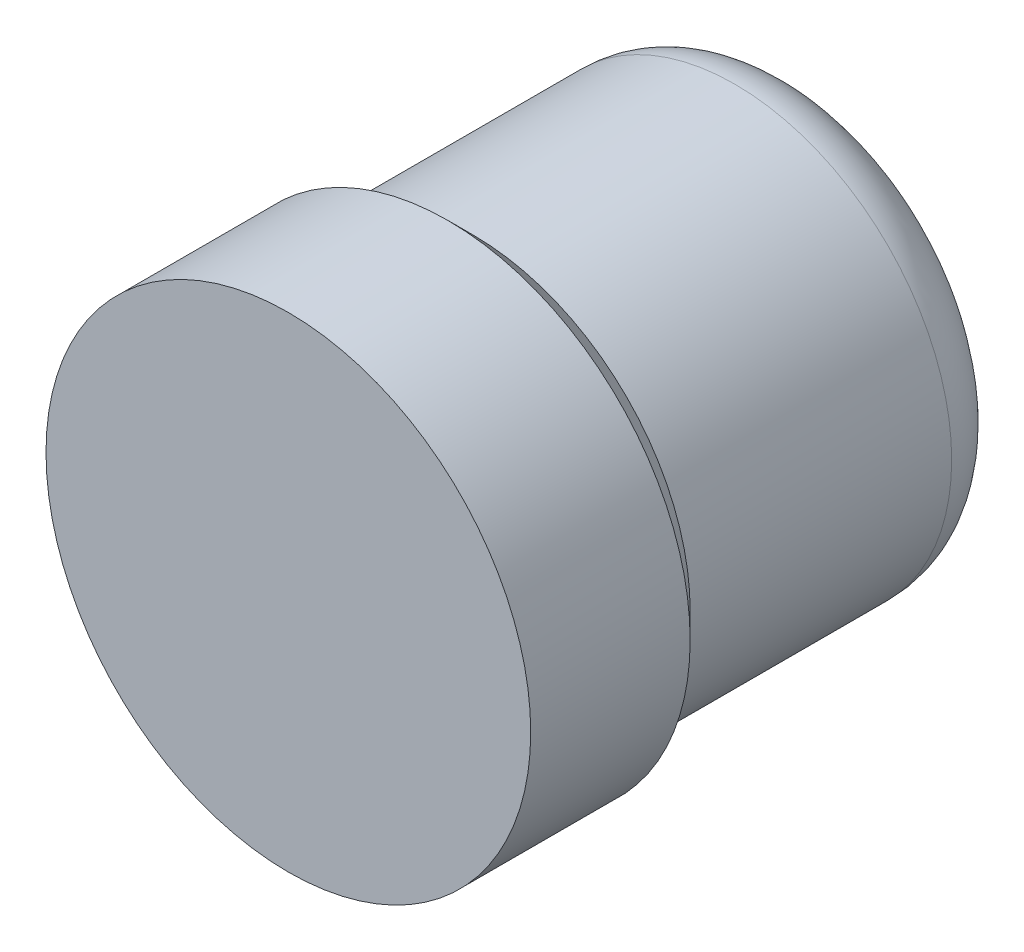
ISO-10303-21;
HEADER;
FILE_DESCRIPTION(('STEP AP214'),'2;1');
FILE_NAME('part.step','',(''),(''),'','','');
FILE_SCHEMA(('AUTOMOTIVE_DESIGN { 1 0 10303 214 1 1 1 1 }'));
ENDSEC;
DATA;
#1=APPLICATION_CONTEXT('core data for automotive mechanical design processes');
#2=APPLICATION_PROTOCOL_DEFINITION('international standard','automotive_design',2000,#1);
#3=PRODUCT_CONTEXT('',#1,'mechanical');
#4=PRODUCT('Part','Part','',(#3));
#5=PRODUCT_RELATED_PRODUCT_CATEGORY('part','',(#4));
#6=PRODUCT_DEFINITION_FORMATION('','',#4);
#7=PRODUCT_DEFINITION_CONTEXT('part definition',#1,'design');
#8=PRODUCT_DEFINITION('design','',#6,#7);
#9=PRODUCT_DEFINITION_SHAPE('','',#8);
#10=(LENGTH_UNIT() NAMED_UNIT(*) SI_UNIT(.MILLI.,.METRE.));
#11=(NAMED_UNIT(*) PLANE_ANGLE_UNIT() SI_UNIT($,.RADIAN.));
#12=(NAMED_UNIT(*) SI_UNIT($,.STERADIAN.) SOLID_ANGLE_UNIT());
#13=UNCERTAINTY_MEASURE_WITH_UNIT(LENGTH_MEASURE(1.E-05),#10,'distance_accuracy_value','');
#14=(GEOMETRIC_REPRESENTATION_CONTEXT(3) GLOBAL_UNCERTAINTY_ASSIGNED_CONTEXT((#13)) GLOBAL_UNIT_ASSIGNED_CONTEXT((#10,
#11,#12)) REPRESENTATION_CONTEXT('',''));
#15=CARTESIAN_POINT('',(0.,0.,0.));
#16=DIRECTION('',(0.,0.,1.));
#17=DIRECTION('',(1.,0.,0.));
#18=AXIS2_PLACEMENT_3D('',#15,#16,#17);
#19=CARTESIAN_POINT('',(4.30211422042248E-13,21.5,-3.));
#20=DIRECTION('',(0.,0.,1.));
#21=DIRECTION('',(1.,0.,0.));
#22=AXIS2_PLACEMENT_3D('',#19,#20,#21);
#23=CYLINDRICAL_SURFACE('',#22,3.8);
#24=CARTESIAN_POINT('',(4.30211422042248E-13,21.5,-2.49999999999999));
#25=DIRECTION('',(0.,0.,1.));
#26=DIRECTION('',(1.,0.,0.));
#27=AXIS2_PLACEMENT_3D('',#24,#25,#26);
#28=CIRCLE('',#27,3.8);
#29=CARTESIAN_POINT('',(3.80000000000043,21.5,-2.49999999999999));
#30=VERTEX_POINT('',#29);
#31=EDGE_CURVE('E38',#30,#30,#28,.T.);
#32=ORIENTED_EDGE('',*,*,#31,.T.);
#33=EDGE_LOOP('',(#32));
#34=FACE_BOUND('',#33,.T.);
#35=CARTESIAN_POINT('',(4.30211422042248E-13,21.5,0.));
#36=DIRECTION('',(0.,0.,1.));
#37=DIRECTION('',(1.,0.,0.));
#38=AXIS2_PLACEMENT_3D('',#35,#36,#37);
#39=CIRCLE('',#38,3.8);
#40=CARTESIAN_POINT('',(3.80000000000043,21.5,0.));
#41=VERTEX_POINT('',#40);
#42=EDGE_CURVE('E51',#41,#41,#39,.T.);
#43=ORIENTED_EDGE('',*,*,#42,.F.);
#44=EDGE_LOOP('',(#43));
#45=FACE_BOUND('',#44,.T.);
#46=ADVANCED_FACE('F31',(#34,#45),#23,.T.);
#47=CARTESIAN_POINT('',(4.30211422042248E-13,21.5,0.));
#48=DIRECTION('',(0.,0.,1.));
#49=DIRECTION('',(1.,0.,0.));
#50=AXIS2_PLACEMENT_3D('',#47,#48,#49);
#51=PLANE('',#50);
#52=ORIENTED_EDGE('',*,*,#42,.T.);
#53=EDGE_LOOP('',(#52));
#54=FACE_BOUND('',#53,.T.);
#55=ADVANCED_FACE('F55',(#54),#51,.T.);
#56=CARTESIAN_POINT('',(4.30211422042248E-13,21.5,-8.));
#57=DIRECTION('',(0.,0.,1.));
#58=DIRECTION('',(1.,0.,0.));
#59=AXIS2_PLACEMENT_3D('',#56,#57,#58);
#60=CYLINDRICAL_SURFACE('',#59,3.4);
#61=CARTESIAN_POINT('',(4.30211422042248E-13,21.5,-2.9));
#62=DIRECTION('',(0.,0.,1.));
#63=DIRECTION('',(1.,0.,0.));
#64=AXIS2_PLACEMENT_3D('',#61,#62,#63);
#65=CIRCLE('',#64,3.4);
#66=CARTESIAN_POINT('',(3.40000000000043,21.5,-2.9));
#67=VERTEX_POINT('',#66);
#68=EDGE_CURVE('E10',#67,#67,#65,.F.);
#69=ORIENTED_EDGE('',*,*,#68,.T.);
#70=EDGE_LOOP('',(#69));
#71=FACE_BOUND('',#70,.T.);
#72=CARTESIAN_POINT('',(4.30211422042248E-13,21.5,-7.));
#73=DIRECTION('',(0.,0.,-1.));
#74=DIRECTION('',(-1.,0.,0.));
#75=AXIS2_PLACEMENT_3D('',#72,#73,#74);
#76=CIRCLE('',#75,3.4);
#77=CARTESIAN_POINT('',(-3.39999999999957,21.5,-7.));
#78=VERTEX_POINT('',#77);
#79=EDGE_CURVE('E42',#78,#78,#76,.F.);
#80=ORIENTED_EDGE('',*,*,#79,.T.);
#81=EDGE_LOOP('',(#80));
#82=FACE_BOUND('',#81,.T.);
#83=ADVANCED_FACE('F62',(#71,#82),#60,.T.);
#84=CARTESIAN_POINT('',(4.30211422042248E-13,21.5,-8.));
#85=DIRECTION('',(0.,0.,-1.));
#86=DIRECTION('',(-1.,0.,0.));
#87=AXIS2_PLACEMENT_3D('',#84,#85,#86);
#88=PLANE('',#87);
#89=CARTESIAN_POINT('',(4.30211422042248E-13,21.5,-8.));
#90=DIRECTION('',(0.,0.,-1.));
#91=DIRECTION('',(-1.,0.,0.));
#92=AXIS2_PLACEMENT_3D('',#89,#90,#91);
#93=CIRCLE('',#92,2.4);
#94=CARTESIAN_POINT('',(-2.39999999999957,21.5,-8.));
#95=VERTEX_POINT('',#94);
#96=EDGE_CURVE('E46',#95,#95,#93,.T.);
#97=ORIENTED_EDGE('',*,*,#96,.T.);
#98=EDGE_LOOP('',(#97));
#99=FACE_BOUND('',#98,.T.);
#100=ADVANCED_FACE('F67',(#99),#88,.T.);
#101=CARTESIAN_POINT('',(4.30211422042248E-13,21.5,-7.));
#102=DIRECTION('',(0.,0.,-1.));
#103=DIRECTION('',(-1.,0.,0.));
#104=AXIS2_PLACEMENT_3D('',#101,#102,#103);
#105=TOROIDAL_SURFACE('',#104,2.4,1.);
#106=ORIENTED_EDGE('',*,*,#79,.F.);
#107=EDGE_LOOP('',(#106));
#108=FACE_BOUND('',#107,.T.);
#109=ORIENTED_EDGE('',*,*,#96,.F.);
#110=EDGE_LOOP('',(#109));
#111=FACE_BOUND('',#110,.T.);
#112=ADVANCED_FACE('F65',(#108,#111),#105,.T.);
#113=CARTESIAN_POINT('',(4.30211422042248E-13,21.5,-2.49999999999999));
#114=DIRECTION('',(0.,0.,1.));
#115=DIRECTION('',(1.,0.,0.));
#116=AXIS2_PLACEMENT_3D('',#113,#114,#115);
#117=CONICAL_SURFACE('',#116,3.8,0.785398163397443);
#118=ORIENTED_EDGE('',*,*,#68,.F.);
#119=EDGE_LOOP('',(#118));
#120=FACE_BOUND('',#119,.T.);
#121=ORIENTED_EDGE('',*,*,#31,.F.);
#122=EDGE_LOOP('',(#121));
#123=FACE_BOUND('',#122,.T.);
#124=ADVANCED_FACE('F33',(#120,#123),#117,.T.);
#125=CLOSED_SHELL('',(#46,#55,#83,#100,#112,#124));
#126=MANIFOLD_SOLID_BREP('B2',#125);
#127=ADVANCED_BREP_SHAPE_REPRESENTATION('',(#18,#126),#14);
#128=SHAPE_DEFINITION_REPRESENTATION(#9,#127);
ENDSEC;
END-ISO-10303-21;
